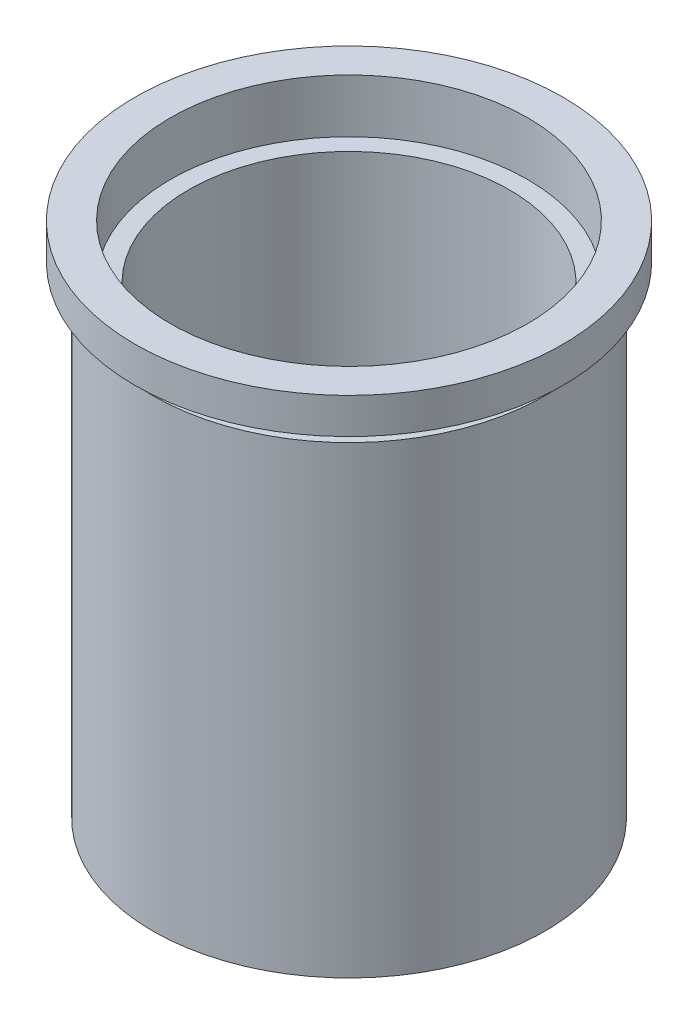
ISO-10303-21;
HEADER;
FILE_DESCRIPTION(('STEP AP214'),'2;1');
FILE_NAME('part.step','',(''),(''),'','','');
FILE_SCHEMA(('AUTOMOTIVE_DESIGN { 1 0 10303 214 1 1 1 1 }'));
ENDSEC;
DATA;
#1=APPLICATION_CONTEXT('core data for automotive mechanical design processes');
#2=APPLICATION_PROTOCOL_DEFINITION('international standard','automotive_design',2000,#1);
#3=PRODUCT_CONTEXT('',#1,'mechanical');
#4=PRODUCT('Part','Part','',(#3));
#5=PRODUCT_RELATED_PRODUCT_CATEGORY('part','',(#4));
#6=PRODUCT_DEFINITION_FORMATION('','',#4);
#7=PRODUCT_DEFINITION_CONTEXT('part definition',#1,'design');
#8=PRODUCT_DEFINITION('design','',#6,#7);
#9=PRODUCT_DEFINITION_SHAPE('','',#8);
#10=(LENGTH_UNIT() NAMED_UNIT(*) SI_UNIT(.MILLI.,.METRE.));
#11=(NAMED_UNIT(*) PLANE_ANGLE_UNIT() SI_UNIT($,.RADIAN.));
#12=(NAMED_UNIT(*) SI_UNIT($,.STERADIAN.) SOLID_ANGLE_UNIT());
#13=UNCERTAINTY_MEASURE_WITH_UNIT(LENGTH_MEASURE(1.E-05),#10,'distance_accuracy_value','');
#14=(GEOMETRIC_REPRESENTATION_CONTEXT(3) GLOBAL_UNCERTAINTY_ASSIGNED_CONTEXT((#13)) GLOBAL_UNIT_ASSIGNED_CONTEXT((#10,
#11,#12)) REPRESENTATION_CONTEXT('',''));
#15=CARTESIAN_POINT('',(0.,0.,0.));
#16=DIRECTION('',(0.,0.,1.));
#17=DIRECTION('',(1.,0.,0.));
#18=AXIS2_PLACEMENT_3D('',#15,#16,#17);
#19=CARTESIAN_POINT('',(0.,0.999999999999997,0.));
#20=DIRECTION('',(0.,-1.,0.));
#21=DIRECTION('',(0.,0.,-1.));
#22=AXIS2_PLACEMENT_3D('',#19,#20,#21);
#23=CYLINDRICAL_SURFACE('',#22,10.01);
#24=CARTESIAN_POINT('',(0.,1.,0.));
#25=DIRECTION('',(0.,1.,0.));
#26=DIRECTION('',(0.,0.,1.));
#27=AXIS2_PLACEMENT_3D('',#24,#25,#26);
#28=CIRCLE('',#27,10.01);
#29=CARTESIAN_POINT('',(0.,1.,-10.01));
#30=VERTEX_POINT('',#29);
#31=EDGE_CURVE('E61',#30,#30,#28,.F.);
#32=CARTESIAN_POINT('',(0.,4.,0.));
#33=DIRECTION('',(0.,1.,0.));
#34=DIRECTION('',(0.,0.,1.));
#35=AXIS2_PLACEMENT_3D('',#32,#33,#34);
#36=CIRCLE('',#35,10.01);
#37=CARTESIAN_POINT('',(0.,4.,-10.01));
#38=VERTEX_POINT('',#37);
#39=EDGE_CURVE('E39',#38,#38,#36,.F.);
#40=CARTESIAN_POINT('',(0.,1.,-10.01));
#41=CARTESIAN_POINT('',(0.,1.03125,-10.01));
#42=CARTESIAN_POINT('',(0.,1.0625,-10.01));
#43=CARTESIAN_POINT('',(0.,1.125,-10.01));
#44=CARTESIAN_POINT('',(0.,1.15625,-10.01));
#45=CARTESIAN_POINT('',(0.,1.21875,-10.01));
#46=CARTESIAN_POINT('',(0.,1.25,-10.01));
#47=CARTESIAN_POINT('',(0.,1.3125,-10.01));
#48=CARTESIAN_POINT('',(0.,1.34375,-10.01));
#49=CARTESIAN_POINT('',(0.,1.40625,-10.01));
#50=CARTESIAN_POINT('',(0.,1.4375,-10.01));
#51=CARTESIAN_POINT('',(0.,1.5,-10.01));
#52=CARTESIAN_POINT('',(0.,1.53125,-10.01));
#53=CARTESIAN_POINT('',(0.,1.59375,-10.01));
#54=CARTESIAN_POINT('',(0.,1.625,-10.01));
#55=CARTESIAN_POINT('',(0.,1.6875,-10.01));
#56=CARTESIAN_POINT('',(0.,1.71875,-10.01));
#57=CARTESIAN_POINT('',(0.,1.78125,-10.01));
#58=CARTESIAN_POINT('',(0.,1.8125,-10.01));
#59=CARTESIAN_POINT('',(0.,1.875,-10.01));
#60=CARTESIAN_POINT('',(0.,1.90625,-10.01));
#61=CARTESIAN_POINT('',(0.,1.96875,-10.01));
#62=CARTESIAN_POINT('',(0.,2.,-10.01));
#63=CARTESIAN_POINT('',(0.,2.0625,-10.01));
#64=CARTESIAN_POINT('',(0.,2.09375,-10.01));
#65=CARTESIAN_POINT('',(0.,2.15625,-10.01));
#66=CARTESIAN_POINT('',(0.,2.1875,-10.01));
#67=CARTESIAN_POINT('',(0.,2.25,-10.01));
#68=CARTESIAN_POINT('',(0.,2.28125,-10.01));
#69=CARTESIAN_POINT('',(0.,2.34375,-10.01));
#70=CARTESIAN_POINT('',(0.,2.375,-10.01));
#71=CARTESIAN_POINT('',(0.,2.4375,-10.01));
#72=CARTESIAN_POINT('',(0.,2.46875,-10.01));
#73=CARTESIAN_POINT('',(0.,2.53125,-10.01));
#74=CARTESIAN_POINT('',(0.,2.5625,-10.01));
#75=CARTESIAN_POINT('',(0.,2.625,-10.01));
#76=CARTESIAN_POINT('',(0.,2.65625,-10.01));
#77=CARTESIAN_POINT('',(0.,2.71875,-10.01));
#78=CARTESIAN_POINT('',(0.,2.75,-10.01));
#79=CARTESIAN_POINT('',(0.,2.8125,-10.01));
#80=CARTESIAN_POINT('',(0.,2.84375,-10.01));
#81=CARTESIAN_POINT('',(0.,2.90625,-10.01));
#82=CARTESIAN_POINT('',(0.,2.9375,-10.01));
#83=CARTESIAN_POINT('',(0.,3.,-10.01));
#84=CARTESIAN_POINT('',(0.,3.03125,-10.01));
#85=CARTESIAN_POINT('',(0.,3.09375,-10.01));
#86=CARTESIAN_POINT('',(0.,3.125,-10.01));
#87=CARTESIAN_POINT('',(0.,3.1875,-10.01));
#88=CARTESIAN_POINT('',(0.,3.21875,-10.01));
#89=CARTESIAN_POINT('',(0.,3.28125,-10.01));
#90=CARTESIAN_POINT('',(0.,3.3125,-10.01));
#91=CARTESIAN_POINT('',(0.,3.375,-10.01));
#92=CARTESIAN_POINT('',(0.,3.40625,-10.01));
#93=CARTESIAN_POINT('',(0.,3.46875,-10.01));
#94=CARTESIAN_POINT('',(0.,3.5,-10.01));
#95=CARTESIAN_POINT('',(0.,3.5625,-10.01));
#96=CARTESIAN_POINT('',(0.,3.59375,-10.01));
#97=CARTESIAN_POINT('',(0.,3.65625,-10.01));
#98=CARTESIAN_POINT('',(0.,3.6875,-10.01));
#99=CARTESIAN_POINT('',(0.,3.75,-10.01));
#100=CARTESIAN_POINT('',(0.,3.78125,-10.01));
#101=CARTESIAN_POINT('',(0.,3.84375,-10.01));
#102=CARTESIAN_POINT('',(0.,3.875,-10.01));
#103=CARTESIAN_POINT('',(0.,3.9375,-10.01));
#104=CARTESIAN_POINT('',(0.,3.96875,-10.01));
#105=CARTESIAN_POINT('',(0.,4.,-10.01));
#106=B_SPLINE_CURVE_WITH_KNOTS('',3,(#40,#41,#42,#43,#44,#45,#46,#47,#48,#49,#50,#51,#52,#53,
#54,#55,#56,#57,#58,#59,#60,#61,#62,#63,#64,#65,#66,#67,#68,#69,#70,#71,#72,#73,#74,#75,#76,#77,
#78,#79,#80,#81,#82,#83,#84,#85,#86,#87,#88,#89,#90,#91,#92,#93,#94,#95,#96,#97,#98,#99,#100,
#101,#102,#103,#104,#105),.UNSPECIFIED.,.F.,.F.,(4,2,2,2,2,2,2,2,2,2,2,2,2,2,2,2,2,2,2,2,2,2,2,
2,2,2,2,2,2,2,2,2,4),(0.,0.0937500000000001,0.1875,0.28125,0.375,0.46875,0.5625,0.65625,0.75,
0.84375,0.9375,1.03125,1.125,1.21875,1.3125,1.40625,1.5,1.59375,1.6875,1.78125,1.875,1.96875,
2.0625,2.15625,2.25,2.34375,2.4375,2.53125,2.625,2.71875,2.8125,2.90625,3.),.UNSPECIFIED.);
#107=EDGE_CURVE('BSEAM35',#30,#38,#106,.T.);
#108=ORIENTED_EDGE('',*,*,#31,.T.);
#109=ORIENTED_EDGE('',*,*,#39,.F.);
#110=ORIENTED_EDGE('',*,*,#107,.T.);
#111=ORIENTED_EDGE('',*,*,#107,.F.);
#112=EDGE_LOOP('',(#108,#110,#109,#111));
#113=FACE_BOUND('',#112,.T.);
#114=ADVANCED_FACE('F35',(#113),#23,.F.);
#115=CARTESIAN_POINT('',(0.,-25.,0.));
#116=DIRECTION('',(0.,-1.,0.));
#117=DIRECTION('',(0.,0.,-1.));
#118=AXIS2_PLACEMENT_3D('',#115,#116,#117);
#119=PLANE('',#118);
#120=CARTESIAN_POINT('',(0.,-25.,0.));
#121=DIRECTION('',(0.,-1.,0.));
#122=DIRECTION('',(0.,0.,-1.));
#123=AXIS2_PLACEMENT_3D('',#120,#121,#122);
#124=CIRCLE('',#123,11.);
#125=CARTESIAN_POINT('',(0.,-25.,-11.));
#126=VERTEX_POINT('',#125);
#127=EDGE_CURVE('E10',#126,#126,#124,.T.);
#128=ORIENTED_EDGE('',*,*,#127,.T.);
#129=EDGE_LOOP('',(#128));
#130=FACE_BOUND('',#129,.T.);
#131=CARTESIAN_POINT('',(0.,-25.,0.));
#132=DIRECTION('',(0.,1.,0.));
#133=DIRECTION('',(0.,0.,1.));
#134=AXIS2_PLACEMENT_3D('',#131,#132,#133);
#135=CIRCLE('',#134,9.);
#136=CARTESIAN_POINT('',(0.,-25.,9.));
#137=VERTEX_POINT('',#136);
#138=EDGE_CURVE('E43',#137,#137,#135,.T.);
#139=ORIENTED_EDGE('',*,*,#138,.T.);
#140=EDGE_LOOP('',(#139));
#141=FACE_BOUND('',#140,.T.);
#142=ADVANCED_FACE('F93',(#130,#141),#119,.T.);
#143=CARTESIAN_POINT('',(0.,1.,0.));
#144=DIRECTION('',(0.,1.,0.));
#145=DIRECTION('',(0.,0.,1.));
#146=AXIS2_PLACEMENT_3D('',#143,#144,#145);
#147=PLANE('',#146);
#148=CARTESIAN_POINT('',(0.,1.,0.));
#149=DIRECTION('',(0.,1.,0.));
#150=DIRECTION('',(0.,0.,1.));
#151=AXIS2_PLACEMENT_3D('',#148,#149,#150);
#152=CIRCLE('',#151,9.);
#153=CARTESIAN_POINT('',(0.,1.,9.));
#154=VERTEX_POINT('',#153);
#155=EDGE_CURVE('E47',#154,#154,#152,.T.);
#156=ORIENTED_EDGE('',*,*,#155,.F.);
#157=EDGE_LOOP('',(#156));
#158=FACE_BOUND('',#157,.T.);
#159=ORIENTED_EDGE('',*,*,#31,.F.);
#160=EDGE_LOOP('',(#159));
#161=FACE_BOUND('',#160,.T.);
#162=ADVANCED_FACE('F37',(#158,#161),#147,.T.);
#163=CARTESIAN_POINT('',(0.,0.999999999999997,0.));
#164=DIRECTION('',(0.,-1.,0.));
#165=DIRECTION('',(0.,0.,-1.));
#166=AXIS2_PLACEMENT_3D('',#163,#164,#165);
#167=CYLINDRICAL_SURFACE('',#166,11.);
#168=CARTESIAN_POINT('',(0.,1.,0.));
#169=DIRECTION('',(0.,-1.,0.));
#170=DIRECTION('',(0.,0.,-1.));
#171=AXIS2_PLACEMENT_3D('',#168,#169,#170);
#172=CIRCLE('',#171,11.);
#173=CARTESIAN_POINT('',(0.,1.,-11.));
#174=VERTEX_POINT('',#173);
#175=EDGE_CURVE('E51',#174,#174,#172,.T.);
#176=CARTESIAN_POINT('',(0.,1.,-11.));
#177=CARTESIAN_POINT('',(0.,0.729166666666667,-11.));
#178=CARTESIAN_POINT('',(0.,0.458333333333334,-11.));
#179=CARTESIAN_POINT('',(0.,-0.0833333333333334,-11.));
#180=CARTESIAN_POINT('',(0.,-0.354166666666667,-11.));
#181=CARTESIAN_POINT('',(0.,-0.895833333333333,-11.));
#182=CARTESIAN_POINT('',(0.,-1.16666666666667,-11.));
#183=CARTESIAN_POINT('',(0.,-1.70833333333333,-11.));
#184=CARTESIAN_POINT('',(0.,-1.97916666666667,-11.));
#185=CARTESIAN_POINT('',(0.,-2.52083333333333,-11.));
#186=CARTESIAN_POINT('',(0.,-2.79166666666667,-11.));
#187=CARTESIAN_POINT('',(0.,-3.33333333333333,-11.));
#188=CARTESIAN_POINT('',(0.,-3.60416666666667,-11.));
#189=CARTESIAN_POINT('',(0.,-4.14583333333333,-11.));
#190=CARTESIAN_POINT('',(0.,-4.41666666666667,-11.));
#191=CARTESIAN_POINT('',(0.,-4.95833333333333,-11.));
#192=CARTESIAN_POINT('',(0.,-5.22916666666667,-11.));
#193=CARTESIAN_POINT('',(0.,-5.77083333333333,-11.));
#194=CARTESIAN_POINT('',(0.,-6.04166666666667,-11.));
#195=CARTESIAN_POINT('',(0.,-6.58333333333333,-11.));
#196=CARTESIAN_POINT('',(0.,-6.85416666666667,-11.));
#197=CARTESIAN_POINT('',(0.,-7.39583333333333,-11.));
#198=CARTESIAN_POINT('',(0.,-7.66666666666667,-11.));
#199=CARTESIAN_POINT('',(0.,-8.20833333333333,-11.));
#200=CARTESIAN_POINT('',(0.,-8.47916666666667,-11.));
#201=CARTESIAN_POINT('',(0.,-9.02083333333333,-11.));
#202=CARTESIAN_POINT('',(0.,-9.29166666666667,-11.));
#203=CARTESIAN_POINT('',(0.,-9.83333333333333,-11.));
#204=CARTESIAN_POINT('',(0.,-10.1041666666667,-11.));
#205=CARTESIAN_POINT('',(0.,-10.6458333333333,-11.));
#206=CARTESIAN_POINT('',(0.,-10.9166666666667,-11.));
#207=CARTESIAN_POINT('',(0.,-11.4583333333333,-11.));
#208=CARTESIAN_POINT('',(0.,-11.7291666666667,-11.));
#209=CARTESIAN_POINT('',(0.,-12.2708333333333,-11.));
#210=CARTESIAN_POINT('',(0.,-12.5416666666667,-11.));
#211=CARTESIAN_POINT('',(0.,-13.0833333333333,-11.));
#212=CARTESIAN_POINT('',(0.,-13.3541666666667,-11.));
#213=CARTESIAN_POINT('',(0.,-13.8958333333333,-11.));
#214=CARTESIAN_POINT('',(0.,-14.1666666666667,-11.));
#215=CARTESIAN_POINT('',(0.,-14.7083333333333,-11.));
#216=CARTESIAN_POINT('',(0.,-14.9791666666667,-11.));
#217=CARTESIAN_POINT('',(0.,-15.5208333333333,-11.));
#218=CARTESIAN_POINT('',(0.,-15.7916666666667,-11.));
#219=CARTESIAN_POINT('',(0.,-16.3333333333333,-11.));
#220=CARTESIAN_POINT('',(0.,-16.6041666666667,-11.));
#221=CARTESIAN_POINT('',(0.,-17.1458333333333,-11.));
#222=CARTESIAN_POINT('',(0.,-17.4166666666667,-11.));
#223=CARTESIAN_POINT('',(0.,-17.9583333333333,-11.));
#224=CARTESIAN_POINT('',(0.,-18.2291666666667,-11.));
#225=CARTESIAN_POINT('',(0.,-18.7708333333333,-11.));
#226=CARTESIAN_POINT('',(0.,-19.0416666666667,-11.));
#227=CARTESIAN_POINT('',(0.,-19.5833333333333,-11.));
#228=CARTESIAN_POINT('',(0.,-19.8541666666667,-11.));
#229=CARTESIAN_POINT('',(0.,-20.3958333333333,-11.));
#230=CARTESIAN_POINT('',(0.,-20.6666666666667,-11.));
#231=CARTESIAN_POINT('',(0.,-21.2083333333333,-11.));
#232=CARTESIAN_POINT('',(0.,-21.4791666666667,-11.));
#233=CARTESIAN_POINT('',(0.,-22.0208333333333,-11.));
#234=CARTESIAN_POINT('',(0.,-22.2916666666667,-11.));
#235=CARTESIAN_POINT('',(0.,-22.8333333333333,-11.));
#236=CARTESIAN_POINT('',(0.,-23.1041666666667,-11.));
#237=CARTESIAN_POINT('',(0.,-23.6458333333333,-11.));
#238=CARTESIAN_POINT('',(0.,-23.9166666666667,-11.));
#239=CARTESIAN_POINT('',(0.,-24.4583333333333,-11.));
#240=CARTESIAN_POINT('',(0.,-24.7291666666667,-11.));
#241=CARTESIAN_POINT('',(0.,-25.,-11.));
#242=B_SPLINE_CURVE_WITH_KNOTS('',3,(#176,#177,#178,#179,#180,#181,#182,#183,#184,#185,#186,
#187,#188,#189,#190,#191,#192,#193,#194,#195,#196,#197,#198,#199,#200,#201,#202,#203,#204,#205,
#206,#207,#208,#209,#210,#211,#212,#213,#214,#215,#216,#217,#218,#219,#220,#221,#222,#223,#224,
#225,#226,#227,#228,#229,#230,#231,#232,#233,#234,#235,#236,#237,#238,#239,#240,#241),
.UNSPECIFIED.,.F.,.F.,(4,2,2,2,2,2,2,2,2,2,2,2,2,2,2,2,2,2,2,2,2,2,2,2,2,2,2,2,2,2,2,2,4),(0.,
0.8125,1.625,2.4375,3.25,4.0625,4.875,5.6875,6.5,7.3125,8.125,8.9375,9.75,10.5625,11.375,
12.1875,13.,13.8125,14.625,15.4375,16.25,17.0625,17.875,18.6875,19.5,20.3125,21.125,21.9375,
22.75,23.5625,24.375,25.1875,26.),.UNSPECIFIED.);
#243=EDGE_CURVE('BSEAM101',#174,#126,#242,.T.);
#244=ORIENTED_EDGE('',*,*,#175,.T.);
#245=ORIENTED_EDGE('',*,*,#127,.F.);
#246=ORIENTED_EDGE('',*,*,#243,.T.);
#247=ORIENTED_EDGE('',*,*,#243,.F.);
#248=EDGE_LOOP('',(#244,#246,#245,#247));
#249=FACE_BOUND('',#248,.T.);
#250=ADVANCED_FACE('F101',(#249),#167,.T.);
#251=CARTESIAN_POINT('',(0.,-25.,0.));
#252=DIRECTION('',(0.,1.,0.));
#253=DIRECTION('',(0.,0.,1.));
#254=AXIS2_PLACEMENT_3D('',#251,#252,#253);
#255=CYLINDRICAL_SURFACE('',#254,9.);
#256=CARTESIAN_POINT('',(0.,-25.,9.));
#257=CARTESIAN_POINT('',(0.,-24.7291666666667,9.));
#258=CARTESIAN_POINT('',(0.,-24.4583333333333,9.));
#259=CARTESIAN_POINT('',(0.,-23.9166666666667,9.));
#260=CARTESIAN_POINT('',(0.,-23.6458333333333,9.));
#261=CARTESIAN_POINT('',(0.,-23.1041666666667,9.));
#262=CARTESIAN_POINT('',(0.,-22.8333333333333,9.));
#263=CARTESIAN_POINT('',(0.,-22.2916666666667,9.));
#264=CARTESIAN_POINT('',(0.,-22.0208333333333,9.));
#265=CARTESIAN_POINT('',(0.,-21.4791666666667,9.));
#266=CARTESIAN_POINT('',(0.,-21.2083333333333,9.));
#267=CARTESIAN_POINT('',(0.,-20.6666666666667,9.));
#268=CARTESIAN_POINT('',(0.,-20.3958333333333,9.));
#269=CARTESIAN_POINT('',(0.,-19.8541666666667,9.));
#270=CARTESIAN_POINT('',(0.,-19.5833333333333,9.));
#271=CARTESIAN_POINT('',(0.,-19.0416666666667,9.));
#272=CARTESIAN_POINT('',(0.,-18.7708333333333,9.));
#273=CARTESIAN_POINT('',(0.,-18.2291666666667,9.));
#274=CARTESIAN_POINT('',(0.,-17.9583333333333,9.));
#275=CARTESIAN_POINT('',(0.,-17.4166666666667,9.));
#276=CARTESIAN_POINT('',(0.,-17.1458333333333,9.));
#277=CARTESIAN_POINT('',(0.,-16.6041666666667,9.));
#278=CARTESIAN_POINT('',(0.,-16.3333333333333,9.));
#279=CARTESIAN_POINT('',(0.,-15.7916666666667,9.));
#280=CARTESIAN_POINT('',(0.,-15.5208333333333,9.));
#281=CARTESIAN_POINT('',(0.,-14.9791666666667,9.));
#282=CARTESIAN_POINT('',(0.,-14.7083333333333,9.));
#283=CARTESIAN_POINT('',(0.,-14.1666666666667,9.));
#284=CARTESIAN_POINT('',(0.,-13.8958333333333,9.));
#285=CARTESIAN_POINT('',(0.,-13.3541666666667,9.));
#286=CARTESIAN_POINT('',(0.,-13.0833333333333,9.));
#287=CARTESIAN_POINT('',(0.,-12.5416666666667,9.));
#288=CARTESIAN_POINT('',(0.,-12.2708333333333,9.));
#289=CARTESIAN_POINT('',(0.,-11.7291666666667,9.));
#290=CARTESIAN_POINT('',(0.,-11.4583333333333,9.));
#291=CARTESIAN_POINT('',(0.,-10.9166666666667,9.));
#292=CARTESIAN_POINT('',(0.,-10.6458333333333,9.));
#293=CARTESIAN_POINT('',(0.,-10.1041666666667,9.));
#294=CARTESIAN_POINT('',(0.,-9.83333333333333,9.));
#295=CARTESIAN_POINT('',(0.,-9.29166666666667,9.));
#296=CARTESIAN_POINT('',(0.,-9.02083333333333,9.));
#297=CARTESIAN_POINT('',(0.,-8.47916666666667,9.));
#298=CARTESIAN_POINT('',(0.,-8.20833333333333,9.));
#299=CARTESIAN_POINT('',(0.,-7.66666666666667,9.));
#300=CARTESIAN_POINT('',(0.,-7.39583333333333,9.));
#301=CARTESIAN_POINT('',(0.,-6.85416666666667,9.));
#302=CARTESIAN_POINT('',(0.,-6.58333333333333,9.));
#303=CARTESIAN_POINT('',(0.,-6.04166666666667,9.));
#304=CARTESIAN_POINT('',(0.,-5.77083333333333,9.));
#305=CARTESIAN_POINT('',(0.,-5.22916666666667,9.));
#306=CARTESIAN_POINT('',(0.,-4.95833333333333,9.));
#307=CARTESIAN_POINT('',(0.,-4.41666666666667,9.));
#308=CARTESIAN_POINT('',(0.,-4.14583333333333,9.));
#309=CARTESIAN_POINT('',(0.,-3.60416666666667,9.));
#310=CARTESIAN_POINT('',(0.,-3.33333333333333,9.));
#311=CARTESIAN_POINT('',(0.,-2.79166666666667,9.));
#312=CARTESIAN_POINT('',(0.,-2.52083333333333,9.));
#313=CARTESIAN_POINT('',(0.,-1.97916666666667,9.));
#314=CARTESIAN_POINT('',(0.,-1.70833333333333,9.));
#315=CARTESIAN_POINT('',(0.,-1.16666666666667,9.));
#316=CARTESIAN_POINT('',(0.,-0.895833333333333,9.));
#317=CARTESIAN_POINT('',(0.,-0.354166666666667,9.));
#318=CARTESIAN_POINT('',(0.,-0.0833333333333333,9.));
#319=CARTESIAN_POINT('',(0.,0.458333333333334,9.));
#320=CARTESIAN_POINT('',(0.,0.729166666666667,9.));
#321=CARTESIAN_POINT('',(0.,1.,9.));
#322=B_SPLINE_CURVE_WITH_KNOTS('',3,(#256,#257,#258,#259,#260,#261,#262,#263,#264,#265,#266,
#267,#268,#269,#270,#271,#272,#273,#274,#275,#276,#277,#278,#279,#280,#281,#282,#283,#284,#285,
#286,#287,#288,#289,#290,#291,#292,#293,#294,#295,#296,#297,#298,#299,#300,#301,#302,#303,#304,
#305,#306,#307,#308,#309,#310,#311,#312,#313,#314,#315,#316,#317,#318,#319,#320,#321),
.UNSPECIFIED.,.F.,.F.,(4,2,2,2,2,2,2,2,2,2,2,2,2,2,2,2,2,2,2,2,2,2,2,2,2,2,2,2,2,2,2,2,4),(0.,
0.812499999999997,1.625,2.4375,3.25,4.0625,4.875,5.6875,6.5,7.3125,8.125,8.9375,9.75,10.5625,
11.375,12.1875,13.,13.8125,14.625,15.4375,16.25,17.0625,17.875,18.6875,19.5,20.3125,21.125,
21.9375,22.75,23.5625,24.375,25.1875,26.),.UNSPECIFIED.);
#323=EDGE_CURVE('BSEAM87',#137,#154,#322,.T.);
#324=ORIENTED_EDGE('',*,*,#138,.F.);
#325=ORIENTED_EDGE('',*,*,#155,.T.);
#326=ORIENTED_EDGE('',*,*,#323,.T.);
#327=ORIENTED_EDGE('',*,*,#323,.F.);
#328=EDGE_LOOP('',(#324,#326,#325,#327));
#329=FACE_BOUND('',#328,.T.);
#330=ADVANCED_FACE('F87',(#329),#255,.F.);
#331=CARTESIAN_POINT('',(0.,1.,0.));
#332=DIRECTION('',(0.,-1.,0.));
#333=DIRECTION('',(0.,0.,-1.));
#334=AXIS2_PLACEMENT_3D('',#331,#332,#333);
#335=PLANE('',#334);
#336=ORIENTED_EDGE('',*,*,#175,.F.);
#337=EDGE_LOOP('',(#336));
#338=FACE_BOUND('',#337,.T.);
#339=CARTESIAN_POINT('',(0.,1.,0.));
#340=DIRECTION('',(0.,-1.,0.));
#341=DIRECTION('',(0.,0.,-1.));
#342=AXIS2_PLACEMENT_3D('',#339,#340,#341);
#343=CIRCLE('',#342,10.5);
#344=CARTESIAN_POINT('',(0.,1.,-10.5));
#345=VERTEX_POINT('',#344);
#346=EDGE_CURVE('E55',#345,#345,#343,.T.);
#347=ORIENTED_EDGE('',*,*,#346,.T.);
#348=EDGE_LOOP('',(#347));
#349=FACE_BOUND('',#348,.T.);
#350=ADVANCED_FACE('F77',(#338,#349),#335,.F.);
#351=CARTESIAN_POINT('',(0.,2.,0.));
#352=DIRECTION('',(0.,-1.,0.));
#353=DIRECTION('',(0.,0.,-1.));
#354=AXIS2_PLACEMENT_3D('',#351,#352,#353);
#355=PLANE('',#354);
#356=CARTESIAN_POINT('',(0.,2.,0.));
#357=DIRECTION('',(0.,-1.,0.));
#358=DIRECTION('',(0.,0.,-1.));
#359=AXIS2_PLACEMENT_3D('',#356,#357,#358);
#360=CIRCLE('',#359,10.5);
#361=CARTESIAN_POINT('',(0.,2.,-10.5));
#362=VERTEX_POINT('',#361);
#363=EDGE_CURVE('E56',#362,#362,#360,.T.);
#364=ORIENTED_EDGE('',*,*,#363,.F.);
#365=EDGE_LOOP('',(#364));
#366=FACE_BOUND('',#365,.T.);
#367=CARTESIAN_POINT('',(0.,2.,0.));
#368=DIRECTION('',(0.,1.,0.));
#369=DIRECTION('',(0.,0.,1.));
#370=AXIS2_PLACEMENT_3D('',#367,#368,#369);
#371=CIRCLE('',#370,12.);
#372=CARTESIAN_POINT('',(0.,2.,12.));
#373=VERTEX_POINT('',#372);
#374=EDGE_CURVE('E64',#373,#373,#371,.T.);
#375=ORIENTED_EDGE('',*,*,#374,.F.);
#376=EDGE_LOOP('',(#375));
#377=FACE_BOUND('',#376,.T.);
#378=ADVANCED_FACE('F74',(#366,#377),#355,.T.);
#379=CARTESIAN_POINT('',(0.,1.,0.));
#380=DIRECTION('',(0.,1.,0.));
#381=DIRECTION('',(0.,0.,1.));
#382=AXIS2_PLACEMENT_3D('',#379,#380,#381);
#383=CYLINDRICAL_SURFACE('',#382,10.5);
#384=ORIENTED_EDGE('',*,*,#346,.F.);
#385=EDGE_LOOP('',(#384));
#386=FACE_BOUND('',#385,.T.);
#387=ORIENTED_EDGE('',*,*,#363,.T.);
#388=EDGE_LOOP('',(#387));
#389=FACE_BOUND('',#388,.T.);
#390=ADVANCED_FACE('F76',(#386,#389),#383,.T.);
#391=CARTESIAN_POINT('',(1.66533578525254E-13,4.,0.));
#392=DIRECTION('',(0.,1.,0.));
#393=DIRECTION('',(0.,0.,1.));
#394=AXIS2_PLACEMENT_3D('',#391,#392,#393);
#395=PLANE('',#394);
#396=ORIENTED_EDGE('',*,*,#39,.T.);
#397=EDGE_LOOP('',(#396));
#398=FACE_BOUND('',#397,.T.);
#399=CARTESIAN_POINT('',(0.,4.,0.));
#400=DIRECTION('',(0.,1.,0.));
#401=DIRECTION('',(0.,0.,1.));
#402=AXIS2_PLACEMENT_3D('',#399,#400,#401);
#403=CIRCLE('',#402,12.);
#404=CARTESIAN_POINT('',(0.,4.,12.));
#405=VERTEX_POINT('',#404);
#406=EDGE_CURVE('E65',#405,#405,#403,.T.);
#407=ORIENTED_EDGE('',*,*,#406,.T.);
#408=EDGE_LOOP('',(#407));
#409=FACE_BOUND('',#408,.T.);
#410=ADVANCED_FACE('F84',(#398,#409),#395,.T.);
#411=CARTESIAN_POINT('',(0.,2.,0.));
#412=DIRECTION('',(0.,1.,0.));
#413=DIRECTION('',(0.,0.,1.));
#414=AXIS2_PLACEMENT_3D('',#411,#412,#413);
#415=CYLINDRICAL_SURFACE('',#414,12.);
#416=ORIENTED_EDGE('',*,*,#374,.T.);
#417=EDGE_LOOP('',(#416));
#418=FACE_BOUND('',#417,.T.);
#419=ORIENTED_EDGE('',*,*,#406,.F.);
#420=EDGE_LOOP('',(#419));
#421=FACE_BOUND('',#420,.T.);
#422=ADVANCED_FACE('F71',(#418,#421),#415,.T.);
#423=CLOSED_SHELL('',(#114,#142,#162,#250,#330,#350,#378,#390,#410,#422));
#424=MANIFOLD_SOLID_BREP('B2',#423);
#425=ADVANCED_BREP_SHAPE_REPRESENTATION('',(#18,#424),#14);
#426=SHAPE_DEFINITION_REPRESENTATION(#9,#425);
ENDSEC;
END-ISO-10303-21;
